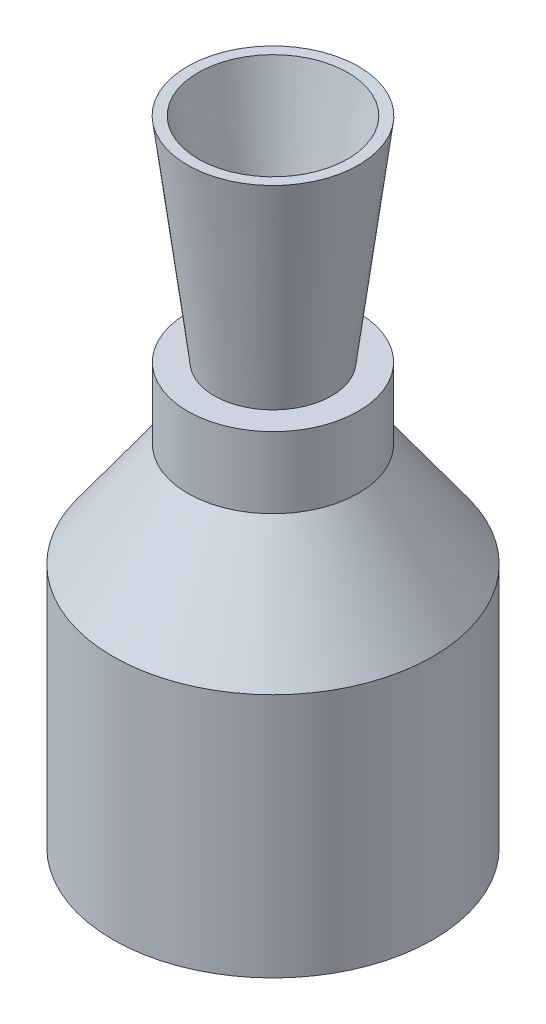
ISO-10303-21;
HEADER;
FILE_DESCRIPTION(('STEP AP214'),'2;1');
FILE_NAME('part.step','',(''),(''),'','','');
FILE_SCHEMA(('AUTOMOTIVE_DESIGN { 1 0 10303 214 1 1 1 1 }'));
ENDSEC;
DATA;
#1=APPLICATION_CONTEXT('core data for automotive mechanical design processes');
#2=APPLICATION_PROTOCOL_DEFINITION('international standard','automotive_design',2000,#1);
#3=PRODUCT_CONTEXT('',#1,'mechanical');
#4=PRODUCT('Part','Part','',(#3));
#5=PRODUCT_RELATED_PRODUCT_CATEGORY('part','',(#4));
#6=PRODUCT_DEFINITION_FORMATION('','',#4);
#7=PRODUCT_DEFINITION_CONTEXT('part definition',#1,'design');
#8=PRODUCT_DEFINITION('design','',#6,#7);
#9=PRODUCT_DEFINITION_SHAPE('','',#8);
#10=(LENGTH_UNIT() NAMED_UNIT(*) SI_UNIT(.MILLI.,.METRE.));
#11=(NAMED_UNIT(*) PLANE_ANGLE_UNIT() SI_UNIT($,.RADIAN.));
#12=(NAMED_UNIT(*) SI_UNIT($,.STERADIAN.) SOLID_ANGLE_UNIT());
#13=UNCERTAINTY_MEASURE_WITH_UNIT(LENGTH_MEASURE(1.E-05),#10,'distance_accuracy_value','');
#14=(GEOMETRIC_REPRESENTATION_CONTEXT(3) GLOBAL_UNCERTAINTY_ASSIGNED_CONTEXT((#13)) GLOBAL_UNIT_ASSIGNED_CONTEXT((#10,
#11,#12)) REPRESENTATION_CONTEXT('',''));
#15=CARTESIAN_POINT('',(0.,0.,0.));
#16=DIRECTION('',(0.,0.,1.));
#17=DIRECTION('',(1.,0.,0.));
#18=AXIS2_PLACEMENT_3D('',#15,#16,#17);
#19=CARTESIAN_POINT('',(3.5,59.1201915172134,0.));
#20=DIRECTION('',(0.,1.,0.));
#21=DIRECTION('',(0.,0.,1.));
#22=AXIS2_PLACEMENT_3D('',#19,#20,#21);
#23=PLANE('',#22);
#24=CARTESIAN_POINT('',(0.,59.1201915172134,0.));
#25=DIRECTION('',(0.,-1.,0.));
#26=DIRECTION('',(0.,0.,-1.));
#27=AXIS2_PLACEMENT_3D('',#24,#25,#26);
#28=CIRCLE('',#27,12.);
#29=CARTESIAN_POINT('',(0.,59.1201915172134,-12.));
#30=VERTEX_POINT('',#29);
#31=EDGE_CURVE('E55',#30,#30,#28,.T.);
#32=ORIENTED_EDGE('',*,*,#31,.F.);
#33=EDGE_LOOP('',(#32));
#34=FACE_BOUND('',#33,.T.);
#35=CARTESIAN_POINT('',(0.,59.1201915172134,0.));
#36=DIRECTION('',(0.,-1.,0.));
#37=DIRECTION('',(0.,0.,-1.));
#38=AXIS2_PLACEMENT_3D('',#35,#36,#37);
#39=CIRCLE('',#38,8.25);
#40=CARTESIAN_POINT('',(0.,59.1201915172134,-8.25));
#41=VERTEX_POINT('',#40);
#42=EDGE_CURVE('E67',#41,#41,#39,.T.);
#43=ORIENTED_EDGE('',*,*,#42,.T.);
#44=EDGE_LOOP('',(#43));
#45=FACE_BOUND('',#44,.T.);
#46=ADVANCED_FACE('F31',(#34,#45),#23,.T.);
#47=CARTESIAN_POINT('',(0.,0.,0.));
#48=DIRECTION('',(0.,1.,0.));
#49=DIRECTION('',(0.,0.,1.));
#50=AXIS2_PLACEMENT_3D('',#47,#48,#49);
#51=PLANE('',#50);
#52=CARTESIAN_POINT('',(0.,0.,0.));
#53=DIRECTION('',(0.,1.,0.));
#54=DIRECTION('',(0.,0.,1.));
#55=AXIS2_PLACEMENT_3D('',#52,#53,#54);
#56=CIRCLE('',#55,22.5);
#57=CARTESIAN_POINT('',(0.,0.,22.5));
#58=VERTEX_POINT('',#57);
#59=EDGE_CURVE('E35',#58,#58,#56,.T.);
#60=ORIENTED_EDGE('',*,*,#59,.F.);
#61=EDGE_LOOP('',(#60));
#62=FACE_BOUND('',#61,.T.);
#63=CARTESIAN_POINT('',(0.,0.,0.));
#64=DIRECTION('',(0.,1.,0.));
#65=DIRECTION('',(0.,0.,1.));
#66=AXIS2_PLACEMENT_3D('',#63,#64,#65);
#67=CIRCLE('',#66,21.);
#68=CARTESIAN_POINT('',(0.,0.,21.));
#69=VERTEX_POINT('',#68);
#70=EDGE_CURVE('E42',#69,#69,#67,.T.);
#71=ORIENTED_EDGE('',*,*,#70,.T.);
#72=EDGE_LOOP('',(#71));
#73=FACE_BOUND('',#72,.T.);
#74=ADVANCED_FACE('F108',(#62,#73),#51,.F.);
#75=CARTESIAN_POINT('',(0.,34.5,0.));
#76=DIRECTION('',(0.,-1.,0.));
#77=DIRECTION('',(0.,0.,-1.));
#78=AXIS2_PLACEMENT_3D('',#75,#76,#77);
#79=CYLINDRICAL_SURFACE('',#78,22.5);
#80=CARTESIAN_POINT('',(0.,34.5,0.));
#81=DIRECTION('',(0.,1.,0.));
#82=DIRECTION('',(0.,0.,1.));
#83=AXIS2_PLACEMENT_3D('',#80,#81,#82);
#84=CIRCLE('',#83,22.5);
#85=CARTESIAN_POINT('',(0.,34.5,22.5));
#86=VERTEX_POINT('',#85);
#87=EDGE_CURVE('E10',#86,#86,#84,.T.);
#88=ORIENTED_EDGE('',*,*,#87,.F.);
#89=EDGE_LOOP('',(#88));
#90=FACE_BOUND('',#89,.T.);
#91=ORIENTED_EDGE('',*,*,#59,.T.);
#92=EDGE_LOOP('',(#91));
#93=FACE_BOUND('',#92,.T.);
#94=ADVANCED_FACE('F33',(#90,#93),#79,.T.);
#95=CARTESIAN_POINT('',(0.,34.5,0.));
#96=DIRECTION('',(0.,-1.,0.));
#97=DIRECTION('',(0.,0.,-1.));
#98=AXIS2_PLACEMENT_3D('',#95,#96,#97);
#99=CYLINDRICAL_SURFACE('',#98,21.);
#100=CARTESIAN_POINT('',(0.,34.5,0.));
#101=DIRECTION('',(0.,-1.,0.));
#102=DIRECTION('',(0.,0.,-1.));
#103=AXIS2_PLACEMENT_3D('',#100,#101,#102);
#104=CIRCLE('',#103,21.);
#105=CARTESIAN_POINT('',(0.,34.5,-21.));
#106=VERTEX_POINT('',#105);
#107=EDGE_CURVE('E46',#106,#106,#104,.T.);
#108=ORIENTED_EDGE('',*,*,#107,.F.);
#109=EDGE_LOOP('',(#108));
#110=FACE_BOUND('',#109,.T.);
#111=ORIENTED_EDGE('',*,*,#70,.F.);
#112=EDGE_LOOP('',(#111));
#113=FACE_BOUND('',#112,.T.);
#114=ADVANCED_FACE('F103',(#110,#113),#99,.F.);
#115=CARTESIAN_POINT('',(0.,49.1201915172134,0.));
#116=DIRECTION('',(0.,-1.,0.));
#117=DIRECTION('',(0.,0.,-1.));
#118=AXIS2_PLACEMENT_3D('',#115,#116,#117);
#119=CONICAL_SURFACE('',#118,3.5,0.874816344811657);
#120=CARTESIAN_POINT('',(0.,49.1201915172134,0.));
#121=DIRECTION('',(0.,-1.,0.));
#122=DIRECTION('',(0.,0.,-1.));
#123=AXIS2_PLACEMENT_3D('',#120,#121,#122);
#124=CIRCLE('',#123,3.5);
#125=CARTESIAN_POINT('',(0.,49.1201915172134,-3.5));
#126=VERTEX_POINT('',#125);
#127=EDGE_CURVE('E49',#126,#126,#124,.T.);
#128=CARTESIAN_POINT('',(0.,34.5,-21.));
#129=CARTESIAN_POINT('',(0.,34.6522936616376,-20.8177083333333));
#130=CARTESIAN_POINT('',(0.,34.8045873232753,-20.6354166666667));
#131=CARTESIAN_POINT('',(0.,35.1091746465506,-20.2708333333333));
#132=CARTESIAN_POINT('',(0.,35.2614683081882,-20.0885416666667));
#133=CARTESIAN_POINT('',(0.,35.5660556314635,-19.7239583333333));
#134=CARTESIAN_POINT('',(0.,35.7183492931011,-19.5416666666667));
#135=CARTESIAN_POINT('',(0.,36.0229366163764,-19.1770833333333));
#136=CARTESIAN_POINT('',(0.,36.1752302780141,-18.9947916666667));
#137=CARTESIAN_POINT('',(0.,36.4798176012893,-18.6302083333333));
#138=CARTESIAN_POINT('',(0.,36.632111262927,-18.4479166666667));
#139=CARTESIAN_POINT('',(0.,36.9366985862022,-18.0833333333333));
#140=CARTESIAN_POINT('',(0.,37.0889922478399,-17.9010416666667));
#141=CARTESIAN_POINT('',(0.,37.3935795711152,-17.5364583333333));
#142=CARTESIAN_POINT('',(0.,37.5458732327528,-17.3541666666667));
#143=CARTESIAN_POINT('',(0.,37.8504605560281,-16.9895833333333));
#144=CARTESIAN_POINT('',(0.,38.0027542176657,-16.8072916666667));
#145=CARTESIAN_POINT('',(0.,38.307341540941,-16.4427083333333));
#146=CARTESIAN_POINT('',(0.,38.4596352025786,-16.2604166666667));
#147=CARTESIAN_POINT('',(0.,38.7642225258539,-15.8958333333333));
#148=CARTESIAN_POINT('',(0.,38.9165161874916,-15.7135416666667));
#149=CARTESIAN_POINT('',(0.,39.2211035107668,-15.3489583333333));
#150=CARTESIAN_POINT('',(0.,39.3733971724045,-15.1666666666667));
#151=CARTESIAN_POINT('',(0.,39.6779844956798,-14.8020833333333));
#152=CARTESIAN_POINT('',(0.,39.8302781573174,-14.6197916666667));
#153=CARTESIAN_POINT('',(0.,40.1348654805927,-14.2552083333333));
#154=CARTESIAN_POINT('',(0.,40.2871591422303,-14.0729166666667));
#155=CARTESIAN_POINT('',(0.,40.5917464655056,-13.7083333333333));
#156=CARTESIAN_POINT('',(0.,40.7440401271433,-13.5260416666667));
#157=CARTESIAN_POINT('',(0.,41.0486274504185,-13.1614583333333));
#158=CARTESIAN_POINT('',(0.,41.2009211120562,-12.9791666666667));
#159=CARTESIAN_POINT('',(0.,41.5055084353314,-12.6145833333333));
#160=CARTESIAN_POINT('',(0.,41.6578020969691,-12.4322916666667));
#161=CARTESIAN_POINT('',(0.,41.9623894202444,-12.0677083333333));
#162=CARTESIAN_POINT('',(0.,42.114683081882,-11.8854166666667));
#163=CARTESIAN_POINT('',(0.,42.4192704051573,-11.5208333333333));
#164=CARTESIAN_POINT('',(0.,42.5715640667949,-11.3385416666667));
#165=CARTESIAN_POINT('',(0.,42.8761513900702,-10.9739583333333));
#166=CARTESIAN_POINT('',(0.,43.0284450517078,-10.7916666666667));
#167=CARTESIAN_POINT('',(0.,43.3330323749831,-10.4270833333333));
#168=CARTESIAN_POINT('',(0.,43.4853260366208,-10.2447916666667));
#169=CARTESIAN_POINT('',(0.,43.789913359896,-9.88020833333333));
#170=CARTESIAN_POINT('',(0.,43.9422070215337,-9.69791666666666));
#171=CARTESIAN_POINT('',(0.,44.246794344809,-9.33333333333333));
#172=CARTESIAN_POINT('',(0.,44.3990880064466,-9.15104166666666));
#173=CARTESIAN_POINT('',(0.,44.7036753297219,-8.78645833333333));
#174=CARTESIAN_POINT('',(0.,44.8559689913595,-8.60416666666666));
#175=CARTESIAN_POINT('',(0.,45.1605563146348,-8.23958333333333));
#176=CARTESIAN_POINT('',(0.,45.3128499762724,-8.05729166666666));
#177=CARTESIAN_POINT('',(0.,45.6174372995477,-7.69270833333333));
#178=CARTESIAN_POINT('',(0.,45.7697309611854,-7.51041666666666));
#179=CARTESIAN_POINT('',(0.,46.0743182844606,-7.14583333333333));
#180=CARTESIAN_POINT('',(0.,46.2266119460983,-6.96354166666666));
#181=CARTESIAN_POINT('',(0.,46.5311992693736,-6.59895833333333));
#182=CARTESIAN_POINT('',(0.,46.6834929310112,-6.41666666666666));
#183=CARTESIAN_POINT('',(0.,46.9880802542865,-6.05208333333333));
#184=CARTESIAN_POINT('',(0.,47.1403739159241,-5.86979166666666));
#185=CARTESIAN_POINT('',(0.,47.4449612391994,-5.50520833333333));
#186=CARTESIAN_POINT('',(0.,47.5972549008371,-5.32291666666666));
#187=CARTESIAN_POINT('',(0.,47.9018422241123,-4.95833333333333));
#188=CARTESIAN_POINT('',(0.,48.05413588575,-4.77604166666666));
#189=CARTESIAN_POINT('',(0.,48.3587232090252,-4.41145833333333));
#190=CARTESIAN_POINT('',(0.,48.5110168706629,-4.22916666666666));
#191=CARTESIAN_POINT('',(0.,48.8156041939382,-3.86458333333333));
#192=CARTESIAN_POINT('',(0.,48.9678978555758,-3.68229166666666));
#193=CARTESIAN_POINT('',(0.,49.1201915172134,-3.5));
#194=B_SPLINE_CURVE_WITH_KNOTS('',3,(#128,#129,#130,#131,#132,#133,#134,#135,#136,#137,#138,
#139,#140,#141,#142,#143,#144,#145,#146,#147,#148,#149,#150,#151,#152,#153,#154,#155,#156,#157,
#158,#159,#160,#161,#162,#163,#164,#165,#166,#167,#168,#169,#170,#171,#172,#173,#174,#175,#176,
#177,#178,#179,#180,#181,#182,#183,#184,#185,#186,#187,#188,#189,#190,#191,#192,#193),
.UNSPECIFIED.,.F.,.F.,(4,2,2,2,2,2,2,2,2,2,2,2,2,2,2,2,2,2,2,2,2,2,2,2,2,2,2,2,2,2,2,2,4),(0.,
0.712609640686961,1.42521928137393,2.13782892206089,2.85043856274785,3.56304820343481,
4.27565784412177,4.98826748480873,5.70087712549569,6.41348676618265,7.12609640686961,
7.83870604755658,8.55131568824354,9.2639253289305,9.97653496961746,10.6891446103044,
11.4017542509914,12.1143638916783,12.8269735323653,13.5395831730523,14.2521928137392,
14.9648024544262,15.6774120951131,16.3900217358001,17.1026313764871,17.815241017174,
18.527850657861,19.2404602985479,19.9530699392349,20.6656795799219,21.3782892206088,
22.0908988612958,22.8035085019827),.UNSPECIFIED.);
#195=EDGE_CURVE('BSEAM94',#106,#126,#194,.T.);
#196=ORIENTED_EDGE('',*,*,#107,.T.);
#197=ORIENTED_EDGE('',*,*,#127,.F.);
#198=ORIENTED_EDGE('',*,*,#195,.T.);
#199=ORIENTED_EDGE('',*,*,#195,.F.);
#200=EDGE_LOOP('',(#196,#198,#197,#199));
#201=FACE_BOUND('',#200,.T.);
#202=ADVANCED_FACE('F94',(#201),#119,.F.);
#203=CARTESIAN_POINT('',(0.,0.,0.));
#204=DIRECTION('',(0.,-1.,0.));
#205=DIRECTION('',(0.,0.,-1.));
#206=AXIS2_PLACEMENT_3D('',#203,#204,#205);
#207=CYLINDRICAL_SURFACE('',#206,3.5);
#208=ORIENTED_EDGE('',*,*,#127,.T.);
#209=EDGE_LOOP('',(#208));
#210=FACE_BOUND('',#209,.T.);
#211=CARTESIAN_POINT('',(0.,59.1201915172134,0.));
#212=DIRECTION('',(0.,-1.,0.));
#213=DIRECTION('',(0.,0.,-1.));
#214=AXIS2_PLACEMENT_3D('',#211,#212,#213);
#215=CIRCLE('',#214,3.5);
#216=CARTESIAN_POINT('',(0.,59.1201915172135,3.5));
#217=VERTEX_POINT('',#216);
#218=EDGE_CURVE('E52',#217,#217,#215,.T.);
#219=ORIENTED_EDGE('',*,*,#218,.F.);
#220=EDGE_LOOP('',(#219));
#221=FACE_BOUND('',#220,.T.);
#222=ADVANCED_FACE('F91',(#210,#221),#207,.F.);
#223=CARTESIAN_POINT('',(0.,0.,0.));
#224=DIRECTION('',(0.,-1.,0.));
#225=DIRECTION('',(0.,0.,-1.));
#226=AXIS2_PLACEMENT_3D('',#223,#224,#225);
#227=CYLINDRICAL_SURFACE('',#226,12.);
#228=ORIENTED_EDGE('',*,*,#31,.T.);
#229=EDGE_LOOP('',(#228));
#230=FACE_BOUND('',#229,.T.);
#231=CARTESIAN_POINT('',(0.,49.1201915172134,0.));
#232=DIRECTION('',(0.,-1.,0.));
#233=DIRECTION('',(0.,0.,-1.));
#234=AXIS2_PLACEMENT_3D('',#231,#232,#233);
#235=CIRCLE('',#234,12.);
#236=CARTESIAN_POINT('',(0.,49.1201915172134,-12.));
#237=VERTEX_POINT('',#236);
#238=EDGE_CURVE('E58',#237,#237,#235,.T.);
#239=ORIENTED_EDGE('',*,*,#238,.F.);
#240=EDGE_LOOP('',(#239));
#241=FACE_BOUND('',#240,.T.);
#242=ADVANCED_FACE('F93',(#230,#241),#227,.T.);
#243=CARTESIAN_POINT('',(0.,34.5,0.));
#244=DIRECTION('',(0.,-1.,0.));
#245=DIRECTION('',(0.,0.,-1.));
#246=AXIS2_PLACEMENT_3D('',#243,#244,#245);
#247=CONICAL_SURFACE('',#246,22.5,0.622826585412003);
#248=ORIENTED_EDGE('',*,*,#238,.T.);
#249=EDGE_LOOP('',(#248));
#250=FACE_BOUND('',#249,.T.);
#251=ORIENTED_EDGE('',*,*,#87,.T.);
#252=EDGE_LOOP('',(#251));
#253=FACE_BOUND('',#252,.T.);
#254=ADVANCED_FACE('F87',(#250,#253),#247,.T.);
#255=CARTESIAN_POINT('',(0.,59.1201915172134,0.));
#256=DIRECTION('',(0.,1.,0.));
#257=DIRECTION('',(0.,0.,1.));
#258=AXIS2_PLACEMENT_3D('',#255,#256,#257);
#259=CONICAL_SURFACE('',#258,3.5,0.230074581906692);
#260=CARTESIAN_POINT('',(0.,89.1201915172135,0.));
#261=DIRECTION('',(0.,-1.,0.));
#262=DIRECTION('',(0.,0.,-1.));
#263=AXIS2_PLACEMENT_3D('',#260,#261,#262);
#264=CIRCLE('',#263,10.5266610333358);
#265=CARTESIAN_POINT('',(0.,89.1201915172135,10.5266610333358));
#266=VERTEX_POINT('',#265);
#267=EDGE_CURVE('E61',#266,#266,#264,.T.);
#268=CARTESIAN_POINT('',(0.,89.1201915172135,10.5266610333358));
#269=CARTESIAN_POINT('',(0.,88.8076915172135,10.4534666475718));
#270=CARTESIAN_POINT('',(0.,88.4951915172135,10.3802722618079));
#271=CARTESIAN_POINT('',(0.,87.8701915172135,10.2338834902801));
#272=CARTESIAN_POINT('',(0.,87.5576915172135,10.1606891045162));
#273=CARTESIAN_POINT('',(0.,86.9326915172135,10.0143003329884));
#274=CARTESIAN_POINT('',(0.,86.6201915172135,9.94110594722445));
#275=CARTESIAN_POINT('',(0.,85.9951915172135,9.79471717569662));
#276=CARTESIAN_POINT('',(0.,85.6826915172135,9.72152278993271));
#277=CARTESIAN_POINT('',(0.,85.0576915172135,9.57513401840488));
#278=CARTESIAN_POINT('',(0.,84.7451915172135,9.50193963264096));
#279=CARTESIAN_POINT('',(0.,84.1201915172135,9.35555086111313));
#280=CARTESIAN_POINT('',(0.,83.8076915172135,9.28235647534922));
#281=CARTESIAN_POINT('',(0.,83.1826915172135,9.13596770382139));
#282=CARTESIAN_POINT('',(0.,82.8701915172135,9.06277331805748));
#283=CARTESIAN_POINT('',(0.,82.2451915172135,8.91638454652965));
#284=CARTESIAN_POINT('',(0.,81.9326915172135,8.84319016076573));
#285=CARTESIAN_POINT('',(0.,81.3076915172135,8.69680138923791));
#286=CARTESIAN_POINT('',(0.,80.9951915172135,8.62360700347399));
#287=CARTESIAN_POINT('',(0.,80.3701915172135,8.47721823194617));
#288=CARTESIAN_POINT('',(0.,80.0576915172135,8.40402384618225));
#289=CARTESIAN_POINT('',(0.,79.4326915172135,8.25763507465442));
#290=CARTESIAN_POINT('',(0.,79.1201915172135,8.18444068889051));
#291=CARTESIAN_POINT('',(0.,78.4951915172135,8.03805191736268));
#292=CARTESIAN_POINT('',(0.,78.1826915172135,7.96485753159877));
#293=CARTESIAN_POINT('',(0.,77.5576915172135,7.81846876007094));
#294=CARTESIAN_POINT('',(0.,77.2451915172135,7.74527437430702));
#295=CARTESIAN_POINT('',(0.,76.6201915172135,7.59888560277919));
#296=CARTESIAN_POINT('',(0.,76.3076915172135,7.52569121701528));
#297=CARTESIAN_POINT('',(0.,75.6826915172134,7.37930244548745));
#298=CARTESIAN_POINT('',(0.,75.3701915172135,7.30610805972354));
#299=CARTESIAN_POINT('',(0.,74.7451915172135,7.15971928819571));
#300=CARTESIAN_POINT('',(0.,74.4326915172134,7.0865249024318));
#301=CARTESIAN_POINT('',(0.,73.8076915172135,6.94013613090397));
#302=CARTESIAN_POINT('',(0.,73.4951915172135,6.86694174514005));
#303=CARTESIAN_POINT('',(0.,72.8701915172135,6.72055297361223));
#304=CARTESIAN_POINT('',(0.,72.5576915172135,6.64735858784831));
#305=CARTESIAN_POINT('',(0.,71.9326915172135,6.50096981632048));
#306=CARTESIAN_POINT('',(0.,71.6201915172135,6.42777543055657));
#307=CARTESIAN_POINT('',(0.,70.9951915172135,6.28138665902874));
#308=CARTESIAN_POINT('',(0.,70.6826915172135,6.20819227326483));
#309=CARTESIAN_POINT('',(0.,70.0576915172135,6.061803501737));
#310=CARTESIAN_POINT('',(0.,69.7451915172135,5.98860911597308));
#311=CARTESIAN_POINT('',(0.,69.1201915172135,5.84222034444525));
#312=CARTESIAN_POINT('',(0.,68.8076915172135,5.76902595868134));
#313=CARTESIAN_POINT('',(0.,68.1826915172135,5.62263718715351));
#314=CARTESIAN_POINT('',(0.,67.8701915172134,5.5494428013896));
#315=CARTESIAN_POINT('',(0.,67.2451915172135,5.40305402986177));
#316=CARTESIAN_POINT('',(0.,66.9326915172135,5.32985964409786));
#317=CARTESIAN_POINT('',(0.,66.3076915172135,5.18347087257003));
#318=CARTESIAN_POINT('',(0.,65.9951915172135,5.11027648680611));
#319=CARTESIAN_POINT('',(0.,65.3701915172134,4.96388771527828));
#320=CARTESIAN_POINT('',(0.,65.0576915172135,4.89069332951437));
#321=CARTESIAN_POINT('',(0.,64.4326915172135,4.74430455798654));
#322=CARTESIAN_POINT('',(0.,64.1201915172134,4.67111017222263));
#323=CARTESIAN_POINT('',(0.,63.4951915172135,4.5247214006948));
#324=CARTESIAN_POINT('',(0.,63.1826915172134,4.45152701493088));
#325=CARTESIAN_POINT('',(0.,62.5576915172134,4.30513824340306));
#326=CARTESIAN_POINT('',(0.,62.2451915172134,4.23194385763914));
#327=CARTESIAN_POINT('',(0.,61.6201915172134,4.08555508611132));
#328=CARTESIAN_POINT('',(0.,61.3076915172135,4.0123607003474));
#329=CARTESIAN_POINT('',(0.,60.6826915172135,3.86597192881957));
#330=CARTESIAN_POINT('',(0.,60.3701915172134,3.79277754305566));
#331=CARTESIAN_POINT('',(0.,59.7451915172134,3.64638877152783));
#332=CARTESIAN_POINT('',(0.,59.4326915172135,3.57319438576392));
#333=CARTESIAN_POINT('',(0.,59.1201915172135,3.5));
#334=B_SPLINE_CURVE_WITH_KNOTS('',3,(#268,#269,#270,#271,#272,#273,#274,#275,#276,#277,#278,
#279,#280,#281,#282,#283,#284,#285,#286,#287,#288,#289,#290,#291,#292,#293,#294,#295,#296,#297,
#298,#299,#300,#301,#302,#303,#304,#305,#306,#307,#308,#309,#310,#311,#312,#313,#314,#315,#316,
#317,#318,#319,#320,#321,#322,#323,#324,#325,#326,#327,#328,#329,#330,#331,#332,#333),
.UNSPECIFIED.,.F.,.F.,(4,2,2,2,2,2,2,2,2,2,2,2,2,2,2,2,2,2,2,2,2,2,2,2,2,2,2,2,2,2,2,2,4),(0.,
0.962872272404912,1.92574454480982,2.88861681721475,3.85148908961966,4.81436136202459,
5.7772336344295,6.74010590683442,7.70297817923934,8.66585045164425,9.62872272404917,
10.5915949964541,11.554467268859,12.5173395412639,13.4802118136688,14.4430840860738,
15.4059563584787,16.3688286308836,17.3317009032885,18.2945731756934,19.2574454480984,
20.2203177205033,21.1831899929082,22.1460622653131,23.108934537718,24.0718068101229,
25.0346790825279,25.9975513549328,26.9604236273377,27.9232958997426,28.8861681721475,
29.8490404445524,30.8119127169574),.UNSPECIFIED.);
#335=EDGE_CURVE('BSEAM81',#266,#217,#334,.T.);
#336=ORIENTED_EDGE('',*,*,#267,.F.);
#337=ORIENTED_EDGE('',*,*,#218,.T.);
#338=ORIENTED_EDGE('',*,*,#335,.T.);
#339=ORIENTED_EDGE('',*,*,#335,.F.);
#340=EDGE_LOOP('',(#336,#338,#337,#339));
#341=FACE_BOUND('',#340,.T.);
#342=ADVANCED_FACE('F81',(#341),#259,.F.);
#343=CARTESIAN_POINT('',(10.5266610333358,89.1201915172135,0.));
#344=DIRECTION('',(0.,-1.,0.));
#345=DIRECTION('',(0.,0.,-1.));
#346=AXIS2_PLACEMENT_3D('',#343,#344,#345);
#347=PLANE('',#346);
#348=CARTESIAN_POINT('',(0.,89.1201915172135,0.));
#349=DIRECTION('',(0.,-1.,0.));
#350=DIRECTION('',(0.,0.,-1.));
#351=AXIS2_PLACEMENT_3D('',#348,#349,#350);
#352=CIRCLE('',#351,12.0266610333358);
#353=CARTESIAN_POINT('',(0.,89.1201915172135,-12.0266610333358));
#354=VERTEX_POINT('',#353);
#355=EDGE_CURVE('E64',#354,#354,#352,.T.);
#356=ORIENTED_EDGE('',*,*,#355,.F.);
#357=EDGE_LOOP('',(#356));
#358=FACE_BOUND('',#357,.T.);
#359=ORIENTED_EDGE('',*,*,#267,.T.);
#360=EDGE_LOOP('',(#359));
#361=FACE_BOUND('',#360,.T.);
#362=ADVANCED_FACE('F75',(#358,#361),#347,.F.);
#363=CARTESIAN_POINT('',(0.,89.1201915172135,0.));
#364=DIRECTION('',(0.,1.,0.));
#365=DIRECTION('',(0.,0.,1.));
#366=AXIS2_PLACEMENT_3D('',#363,#364,#365);
#367=CONICAL_SURFACE('',#366,12.0266610333358,0.125229927410955);
#368=ORIENTED_EDGE('',*,*,#42,.F.);
#369=EDGE_LOOP('',(#368));
#370=FACE_BOUND('',#369,.T.);
#371=ORIENTED_EDGE('',*,*,#355,.T.);
#372=EDGE_LOOP('',(#371));
#373=FACE_BOUND('',#372,.T.);
#374=ADVANCED_FACE('F72',(#370,#373),#367,.T.);
#375=CLOSED_SHELL('',(#46,#74,#94,#114,#202,#222,#242,#254,#342,#362,#374));
#376=MANIFOLD_SOLID_BREP('B2',#375);
#377=ADVANCED_BREP_SHAPE_REPRESENTATION('',(#18,#376),#14);
#378=SHAPE_DEFINITION_REPRESENTATION(#9,#377);
ENDSEC;
END-ISO-10303-21;
